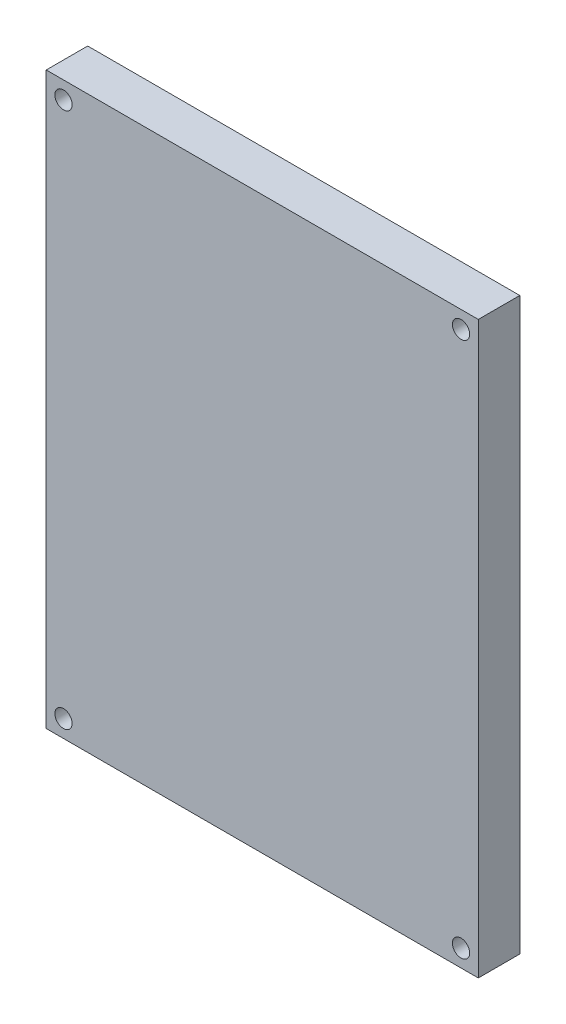
ISO-10303-21;
HEADER;
FILE_DESCRIPTION(('STEP AP214'),'2;1');
FILE_NAME('part.step','',(''),(''),'','','');
FILE_SCHEMA(('AUTOMOTIVE_DESIGN { 1 0 10303 214 1 1 1 1 }'));
ENDSEC;
DATA;
#1=APPLICATION_CONTEXT('core data for automotive mechanical design processes');
#2=APPLICATION_PROTOCOL_DEFINITION('international standard','automotive_design',2000,#1);
#3=PRODUCT_CONTEXT('',#1,'mechanical');
#4=PRODUCT('Part','Part','',(#3));
#5=PRODUCT_RELATED_PRODUCT_CATEGORY('part','',(#4));
#6=PRODUCT_DEFINITION_FORMATION('','',#4);
#7=PRODUCT_DEFINITION_CONTEXT('part definition',#1,'design');
#8=PRODUCT_DEFINITION('design','',#6,#7);
#9=PRODUCT_DEFINITION_SHAPE('','',#8);
#10=(LENGTH_UNIT() NAMED_UNIT(*) SI_UNIT(.MILLI.,.METRE.));
#11=(NAMED_UNIT(*) PLANE_ANGLE_UNIT() SI_UNIT($,.RADIAN.));
#12=(NAMED_UNIT(*) SI_UNIT($,.STERADIAN.) SOLID_ANGLE_UNIT());
#13=UNCERTAINTY_MEASURE_WITH_UNIT(LENGTH_MEASURE(1.E-05),#10,'distance_accuracy_value','');
#14=(GEOMETRIC_REPRESENTATION_CONTEXT(3) GLOBAL_UNCERTAINTY_ASSIGNED_CONTEXT((#13)) GLOBAL_UNIT_ASSIGNED_CONTEXT((#10,
#11,#12)) REPRESENTATION_CONTEXT('',''));
#15=CARTESIAN_POINT('',(0.,0.,0.));
#16=DIRECTION('',(0.,0.,1.));
#17=DIRECTION('',(1.,0.,0.));
#18=AXIS2_PLACEMENT_3D('',#15,#16,#17);
#19=CARTESIAN_POINT('',(0.,-45.5,4.));
#20=DIRECTION('',(0.,1.,0.));
#21=DIRECTION('',(0.,0.,1.));
#22=AXIS2_PLACEMENT_3D('',#19,#20,#21);
#23=PLANE('',#22);
#24=DIRECTION('',(0.,0.,-1.));
#25=VECTOR('',#24,1.);
#26=CARTESIAN_POINT('',(7.49999999999999,-45.5,4.));
#27=LINE('',#26,#25);
#28=CARTESIAN_POINT('',(7.49999999999999,-45.5,4.));
#29=VERTEX_POINT('',#28);
#30=CARTESIAN_POINT('',(7.49999999999999,-45.5,0.));
#31=VERTEX_POINT('',#30);
#32=EDGE_CURVE('E248',#29,#31,#27,.T.);
#33=ORIENTED_EDGE('',*,*,#32,.F.);
#34=DIRECTION('',(1.,0.,0.));
#35=VECTOR('',#34,1.);
#36=CARTESIAN_POINT('',(0.,-45.5,4.));
#37=LINE('',#36,#35);
#38=CARTESIAN_POINT('',(27.5,-45.5,4.));
#39=VERTEX_POINT('',#38);
#40=EDGE_CURVE('E234',#29,#39,#37,.T.);
#41=ORIENTED_EDGE('',*,*,#40,.T.);
#42=DIRECTION('',(0.,0.,1.));
#43=VECTOR('',#42,1.);
#44=CARTESIAN_POINT('',(27.5,-45.5,4.));
#45=LINE('',#44,#43);
#46=CARTESIAN_POINT('',(27.5,-45.5,0.));
#47=VERTEX_POINT('',#46);
#48=EDGE_CURVE('E380',#47,#39,#45,.T.);
#49=ORIENTED_EDGE('',*,*,#48,.F.);
#50=DIRECTION('',(1.,0.,0.));
#51=VECTOR('',#50,1.);
#52=CARTESIAN_POINT('',(0.,-45.5,0.));
#53=LINE('',#52,#51);
#54=EDGE_CURVE('E350',#31,#47,#53,.T.);
#55=ORIENTED_EDGE('',*,*,#54,.F.);
#56=EDGE_LOOP('',(#33,#41,#49,#55));
#57=FACE_BOUND('',#56,.T.);
#58=ADVANCED_FACE('F75',(#57),#23,.T.);
#59=CARTESIAN_POINT('',(32.5,35.,4.));
#60=DIRECTION('',(0.,-1.,0.));
#61=DIRECTION('',(0.,0.,-1.));
#62=AXIS2_PLACEMENT_3D('',#59,#60,#61);
#63=PLANE('',#62);
#64=DIRECTION('',(-1.,0.,0.));
#65=VECTOR('',#64,1.);
#66=CARTESIAN_POINT('',(32.5,35.,0.));
#67=LINE('',#66,#65);
#68=CARTESIAN_POINT('',(32.5,35.,0.));
#69=VERTEX_POINT('',#68);
#70=CARTESIAN_POINT('',(-30.,35.,0.));
#71=VERTEX_POINT('',#70);
#72=EDGE_CURVE('E342',#69,#71,#67,.T.);
#73=ORIENTED_EDGE('',*,*,#72,.T.);
#74=DIRECTION('',(0.,0.,-1.));
#75=VECTOR('',#74,1.);
#76=CARTESIAN_POINT('',(-30.,35.,4.));
#77=LINE('',#76,#75);
#78=CARTESIAN_POINT('',(-30.,35.,6.));
#79=VERTEX_POINT('',#78);
#80=EDGE_CURVE('E372',#79,#71,#77,.T.);
#81=ORIENTED_EDGE('',*,*,#80,.F.);
#82=DIRECTION('',(-1.,0.,0.));
#83=VECTOR('',#82,1.);
#84=CARTESIAN_POINT('',(-30.,35.,6.));
#85=LINE('',#84,#83);
#86=CARTESIAN_POINT('',(32.5,35.,6.));
#87=VERTEX_POINT('',#86);
#88=EDGE_CURVE('E277',#87,#79,#85,.T.);
#89=ORIENTED_EDGE('',*,*,#88,.F.);
#90=DIRECTION('',(0.,0.,-1.));
#91=VECTOR('',#90,1.);
#92=CARTESIAN_POINT('',(32.5,35.,4.));
#93=LINE('',#92,#91);
#94=EDGE_CURVE('E363',#87,#69,#93,.T.);
#95=ORIENTED_EDGE('',*,*,#94,.T.);
#96=EDGE_LOOP('',(#73,#81,#89,#95));
#97=FACE_BOUND('',#96,.T.);
#98=ADVANCED_FACE('F77',(#97),#63,.F.);
#99=CARTESIAN_POINT('',(-30.,35.,4.));
#100=DIRECTION('',(1.,0.,0.));
#101=DIRECTION('',(0.,0.,-1.));
#102=AXIS2_PLACEMENT_3D('',#99,#100,#101);
#103=PLANE('',#102);
#104=DIRECTION('',(0.,0.,-1.));
#105=VECTOR('',#104,1.);
#106=CARTESIAN_POINT('',(-30.,-47.5,4.));
#107=LINE('',#106,#105);
#108=CARTESIAN_POINT('',(-30.,-47.5,6.));
#109=VERTEX_POINT('',#108);
#110=CARTESIAN_POINT('',(-30.,-47.5,0.));
#111=VERTEX_POINT('',#110);
#112=EDGE_CURVE('E369',#109,#111,#107,.T.);
#113=ORIENTED_EDGE('',*,*,#112,.F.);
#114=DIRECTION('',(0.,-1.,0.));
#115=VECTOR('',#114,1.);
#116=CARTESIAN_POINT('',(-30.,-47.5,6.));
#117=LINE('',#116,#115);
#118=EDGE_CURVE('E268',#79,#109,#117,.T.);
#119=ORIENTED_EDGE('',*,*,#118,.F.);
#120=ORIENTED_EDGE('',*,*,#80,.T.);
#121=DIRECTION('',(0.,-1.,0.));
#122=VECTOR('',#121,1.);
#123=CARTESIAN_POINT('',(-30.,35.,0.));
#124=LINE('',#123,#122);
#125=EDGE_CURVE('E355',#71,#111,#124,.T.);
#126=ORIENTED_EDGE('',*,*,#125,.T.);
#127=EDGE_LOOP('',(#113,#119,#120,#126));
#128=FACE_BOUND('',#127,.T.);
#129=ADVANCED_FACE('F426',(#128),#103,.F.);
#130=CARTESIAN_POINT('',(-30.,-47.5,4.));
#131=DIRECTION('',(0.,1.,0.));
#132=DIRECTION('',(0.,0.,1.));
#133=AXIS2_PLACEMENT_3D('',#130,#131,#132);
#134=PLANE('',#133);
#135=DIRECTION('',(-1.,0.,0.));
#136=VECTOR('',#135,1.);
#137=CARTESIAN_POINT('',(7.49999999999999,-47.5,4.));
#138=LINE('',#137,#136);
#139=CARTESIAN_POINT('',(7.49999999999999,-47.5,4.));
#140=VERTEX_POINT('',#139);
#141=CARTESIAN_POINT('',(-5.,-47.5,4.));
#142=VERTEX_POINT('',#141);
#143=EDGE_CURVE('E231',#140,#142,#138,.T.);
#144=ORIENTED_EDGE('',*,*,#143,.F.);
#145=DIRECTION('',(0.,0.,-1.));
#146=VECTOR('',#145,1.);
#147=CARTESIAN_POINT('',(7.49999999999999,-47.5,4.));
#148=LINE('',#147,#146);
#149=CARTESIAN_POINT('',(7.49999999999999,-47.5,0.));
#150=VERTEX_POINT('',#149);
#151=EDGE_CURVE('E216',#140,#150,#148,.T.);
#152=ORIENTED_EDGE('',*,*,#151,.T.);
#153=DIRECTION('',(1.,0.,0.));
#154=VECTOR('',#153,1.);
#155=CARTESIAN_POINT('',(-30.,-47.5,0.));
#156=LINE('',#155,#154);
#157=CARTESIAN_POINT('',(32.5,-47.5,0.));
#158=VERTEX_POINT('',#157);
#159=EDGE_CURVE('E357',#150,#158,#156,.T.);
#160=ORIENTED_EDGE('',*,*,#159,.T.);
#161=DIRECTION('',(0.,0.,-1.));
#162=VECTOR('',#161,1.);
#163=CARTESIAN_POINT('',(32.5,-47.5,4.));
#164=LINE('',#163,#162);
#165=CARTESIAN_POINT('',(32.5,-47.5,6.));
#166=VERTEX_POINT('',#165);
#167=EDGE_CURVE('E366',#166,#158,#164,.T.);
#168=ORIENTED_EDGE('',*,*,#167,.F.);
#169=DIRECTION('',(1.,0.,0.));
#170=VECTOR('',#169,1.);
#171=CARTESIAN_POINT('',(-30.,-47.5,6.));
#172=LINE('',#171,#170);
#173=EDGE_CURVE('E271',#109,#166,#172,.T.);
#174=ORIENTED_EDGE('',*,*,#173,.F.);
#175=ORIENTED_EDGE('',*,*,#112,.T.);
#176=CARTESIAN_POINT('',(-5.,-47.5,0.));
#177=VERTEX_POINT('',#176);
#178=EDGE_CURVE('E358',#111,#177,#156,.T.);
#179=ORIENTED_EDGE('',*,*,#178,.T.);
#180=DIRECTION('',(0.,0.,-1.));
#181=VECTOR('',#180,1.);
#182=CARTESIAN_POINT('',(-5.,-47.5,4.));
#183=LINE('',#182,#181);
#184=EDGE_CURVE('E226',#142,#177,#183,.T.);
#185=ORIENTED_EDGE('',*,*,#184,.F.);
#186=EDGE_LOOP('',(#144,#152,#160,#168,#174,#175,#179,#185));
#187=FACE_BOUND('',#186,.T.);
#188=ADVANCED_FACE('F237',(#187),#134,.F.);
#189=CARTESIAN_POINT('',(32.5,-47.5,4.));
#190=DIRECTION('',(-1.,0.,0.));
#191=DIRECTION('',(0.,0.,1.));
#192=AXIS2_PLACEMENT_3D('',#189,#190,#191);
#193=PLANE('',#192);
#194=DIRECTION('',(0.,1.,0.));
#195=VECTOR('',#194,1.);
#196=CARTESIAN_POINT('',(32.5,-47.5,0.));
#197=LINE('',#196,#195);
#198=EDGE_CURVE('E361',#158,#69,#197,.T.);
#199=ORIENTED_EDGE('',*,*,#198,.T.);
#200=ORIENTED_EDGE('',*,*,#94,.F.);
#201=DIRECTION('',(0.,1.,0.));
#202=VECTOR('',#201,1.);
#203=CARTESIAN_POINT('',(32.5,-47.5,6.));
#204=LINE('',#203,#202);
#205=EDGE_CURVE('E274',#166,#87,#204,.T.);
#206=ORIENTED_EDGE('',*,*,#205,.F.);
#207=ORIENTED_EDGE('',*,*,#167,.T.);
#208=EDGE_LOOP('',(#199,#200,#206,#207));
#209=FACE_BOUND('',#208,.T.);
#210=ADVANCED_FACE('F431',(#209),#193,.F.);
#211=CARTESIAN_POINT('',(0.,0.,0.));
#212=DIRECTION('',(0.,0.,1.));
#213=DIRECTION('',(1.,0.,0.));
#214=AXIS2_PLACEMENT_3D('',#211,#212,#213);
#215=PLANE('',#214);
#216=CARTESIAN_POINT('',(30.,-45.,0.));
#217=DIRECTION('',(0.,0.,1.));
#218=DIRECTION('',(1.,0.,0.));
#219=AXIS2_PLACEMENT_3D('',#216,#217,#218);
#220=CIRCLE('',#219,1.25);
#221=CARTESIAN_POINT('',(31.25,-45.,0.));
#222=VERTEX_POINT('',#221);
#223=EDGE_CURVE('E79',#222,#222,#220,.T.);
#224=ORIENTED_EDGE('',*,*,#223,.T.);
#225=EDGE_LOOP('',(#224));
#226=FACE_BOUND('',#225,.T.);
#227=CARTESIAN_POINT('',(-27.5,32.5,0.));
#228=DIRECTION('',(0.,0.,1.));
#229=DIRECTION('',(1.,0.,0.));
#230=AXIS2_PLACEMENT_3D('',#227,#228,#229);
#231=CIRCLE('',#230,1.25);
#232=CARTESIAN_POINT('',(-26.25,32.5,0.));
#233=VERTEX_POINT('',#232);
#234=EDGE_CURVE('E395',#233,#233,#231,.T.);
#235=ORIENTED_EDGE('',*,*,#234,.T.);
#236=EDGE_LOOP('',(#235));
#237=FACE_BOUND('',#236,.T.);
#238=CARTESIAN_POINT('',(30.,32.5,0.));
#239=DIRECTION('',(0.,0.,1.));
#240=DIRECTION('',(1.,0.,0.));
#241=AXIS2_PLACEMENT_3D('',#238,#239,#240);
#242=CIRCLE('',#241,1.25);
#243=CARTESIAN_POINT('',(31.25,32.5,0.));
#244=VERTEX_POINT('',#243);
#245=EDGE_CURVE('E393',#244,#244,#242,.T.);
#246=ORIENTED_EDGE('',*,*,#245,.T.);
#247=EDGE_LOOP('',(#246));
#248=FACE_BOUND('',#247,.T.);
#249=CARTESIAN_POINT('',(-27.5,-45.,0.));
#250=DIRECTION('',(0.,0.,1.));
#251=DIRECTION('',(1.,0.,0.));
#252=AXIS2_PLACEMENT_3D('',#249,#250,#251);
#253=CIRCLE('',#252,1.25);
#254=CARTESIAN_POINT('',(-26.25,-45.,0.));
#255=VERTEX_POINT('',#254);
#256=EDGE_CURVE('E267',#255,#255,#253,.T.);
#257=ORIENTED_EDGE('',*,*,#256,.T.);
#258=EDGE_LOOP('',(#257));
#259=FACE_BOUND('',#258,.T.);
#260=ORIENTED_EDGE('',*,*,#159,.F.);
#261=DIRECTION('',(0.,-1.,0.));
#262=VECTOR('',#261,1.);
#263=CARTESIAN_POINT('',(7.49999999999999,-47.5,0.));
#264=LINE('',#263,#262);
#265=EDGE_CURVE('E222',#31,#150,#264,.T.);
#266=ORIENTED_EDGE('',*,*,#265,.F.);
#267=ORIENTED_EDGE('',*,*,#54,.T.);
#268=DIRECTION('',(0.,1.,0.));
#269=VECTOR('',#268,1.);
#270=CARTESIAN_POINT('',(27.5,-47.5,0.));
#271=LINE('',#270,#269);
#272=CARTESIAN_POINT('',(27.5,-42.5,0.));
#273=VERTEX_POINT('',#272);
#274=EDGE_CURVE('E308',#47,#273,#271,.T.);
#275=ORIENTED_EDGE('',*,*,#274,.T.);
#276=DIRECTION('',(1.,0.,0.));
#277=VECTOR('',#276,1.);
#278=CARTESIAN_POINT('',(32.5,-42.5,0.));
#279=LINE('',#278,#277);
#280=CARTESIAN_POINT('',(30.5,-42.5,0.));
#281=VERTEX_POINT('',#280);
#282=EDGE_CURVE('E304',#273,#281,#279,.T.);
#283=ORIENTED_EDGE('',*,*,#282,.T.);
#284=DIRECTION('',(0.,1.,0.));
#285=VECTOR('',#284,1.);
#286=CARTESIAN_POINT('',(30.5,0.,0.));
#287=LINE('',#286,#285);
#288=CARTESIAN_POINT('',(30.5,30.,0.));
#289=VERTEX_POINT('',#288);
#290=EDGE_CURVE('E321',#281,#289,#287,.T.);
#291=ORIENTED_EDGE('',*,*,#290,.T.);
#292=DIRECTION('',(-1.,0.,0.));
#293=VECTOR('',#292,1.);
#294=CARTESIAN_POINT('',(32.5,30.,0.));
#295=LINE('',#294,#293);
#296=CARTESIAN_POINT('',(27.5,30.,0.));
#297=VERTEX_POINT('',#296);
#298=EDGE_CURVE('E294',#289,#297,#295,.T.);
#299=ORIENTED_EDGE('',*,*,#298,.T.);
#300=DIRECTION('',(0.,1.,0.));
#301=VECTOR('',#300,1.);
#302=CARTESIAN_POINT('',(27.5,35.,0.));
#303=LINE('',#302,#301);
#304=CARTESIAN_POINT('',(27.5,33.,0.));
#305=VERTEX_POINT('',#304);
#306=EDGE_CURVE('E292',#297,#305,#303,.T.);
#307=ORIENTED_EDGE('',*,*,#306,.T.);
#308=DIRECTION('',(-1.,0.,0.));
#309=VECTOR('',#308,1.);
#310=CARTESIAN_POINT('',(0.,33.,0.));
#311=LINE('',#310,#309);
#312=CARTESIAN_POINT('',(-25.,33.,0.));
#313=VERTEX_POINT('',#312);
#314=EDGE_CURVE('E345',#305,#313,#311,.T.);
#315=ORIENTED_EDGE('',*,*,#314,.T.);
#316=DIRECTION('',(0.,-1.,0.));
#317=VECTOR('',#316,1.);
#318=CARTESIAN_POINT('',(-25.,35.,0.));
#319=LINE('',#318,#317);
#320=CARTESIAN_POINT('',(-25.,30.,0.));
#321=VERTEX_POINT('',#320);
#322=EDGE_CURVE('E283',#313,#321,#319,.T.);
#323=ORIENTED_EDGE('',*,*,#322,.T.);
#324=DIRECTION('',(-1.,0.,0.));
#325=VECTOR('',#324,1.);
#326=CARTESIAN_POINT('',(-30.,30.,0.));
#327=LINE('',#326,#325);
#328=CARTESIAN_POINT('',(-28.,30.,0.));
#329=VERTEX_POINT('',#328);
#330=EDGE_CURVE('E100',#321,#329,#327,.T.);
#331=ORIENTED_EDGE('',*,*,#330,.T.);
#332=DIRECTION('',(0.,-1.,0.));
#333=VECTOR('',#332,1.);
#334=CARTESIAN_POINT('',(-28.,0.,0.));
#335=LINE('',#334,#333);
#336=CARTESIAN_POINT('',(-28.,-42.5,0.));
#337=VERTEX_POINT('',#336);
#338=EDGE_CURVE('E348',#329,#337,#335,.T.);
#339=ORIENTED_EDGE('',*,*,#338,.T.);
#340=DIRECTION('',(1.,0.,0.));
#341=VECTOR('',#340,1.);
#342=CARTESIAN_POINT('',(-30.,-42.5,0.));
#343=LINE('',#342,#341);
#344=CARTESIAN_POINT('',(-25.,-42.5,0.));
#345=VERTEX_POINT('',#344);
#346=EDGE_CURVE('E318',#337,#345,#343,.T.);
#347=ORIENTED_EDGE('',*,*,#346,.T.);
#348=DIRECTION('',(0.,-1.,0.));
#349=VECTOR('',#348,1.);
#350=CARTESIAN_POINT('',(-25.,-47.5,0.));
#351=LINE('',#350,#349);
#352=CARTESIAN_POINT('',(-25.,-45.5,0.));
#353=VERTEX_POINT('',#352);
#354=EDGE_CURVE('E316',#345,#353,#351,.T.);
#355=ORIENTED_EDGE('',*,*,#354,.T.);
#356=CARTESIAN_POINT('',(-5.,-45.5,0.));
#357=VERTEX_POINT('',#356);
#358=EDGE_CURVE('E332',#353,#357,#53,.T.);
#359=ORIENTED_EDGE('',*,*,#358,.T.);
#360=DIRECTION('',(0.,1.,0.));
#361=VECTOR('',#360,1.);
#362=CARTESIAN_POINT('',(-5.,-47.5,0.));
#363=LINE('',#362,#361);
#364=EDGE_CURVE('E235',#177,#357,#363,.T.);
#365=ORIENTED_EDGE('',*,*,#364,.F.);
#366=ORIENTED_EDGE('',*,*,#178,.F.);
#367=ORIENTED_EDGE('',*,*,#125,.F.);
#368=ORIENTED_EDGE('',*,*,#72,.F.);
#369=ORIENTED_EDGE('',*,*,#198,.F.);
#370=EDGE_LOOP('',(#260,#266,#267,#275,#283,#291,#299,#307,#315,#323,#331,#339,#347,#355,#359,
#365,#366,#367,#368,#369));
#371=FACE_BOUND('',#370,.T.);
#372=ADVANCED_FACE('F402',(#226,#237,#248,#259,#371),#215,.F.);
#373=CARTESIAN_POINT('',(30.5,0.,4.));
#374=DIRECTION('',(-1.,0.,0.));
#375=DIRECTION('',(0.,0.,1.));
#376=AXIS2_PLACEMENT_3D('',#373,#374,#375);
#377=PLANE('',#376);
#378=DIRECTION('',(0.,0.,1.));
#379=VECTOR('',#378,1.);
#380=CARTESIAN_POINT('',(30.5,30.,4.));
#381=LINE('',#380,#379);
#382=CARTESIAN_POINT('',(30.5,30.,4.));
#383=VERTEX_POINT('',#382);
#384=EDGE_CURVE('E388',#289,#383,#381,.T.);
#385=ORIENTED_EDGE('',*,*,#384,.F.);
#386=ORIENTED_EDGE('',*,*,#290,.F.);
#387=DIRECTION('',(0.,0.,-1.));
#388=VECTOR('',#387,1.);
#389=CARTESIAN_POINT('',(30.5,-42.5,4.));
#390=LINE('',#389,#388);
#391=CARTESIAN_POINT('',(30.5,-42.5,4.));
#392=VERTEX_POINT('',#391);
#393=EDGE_CURVE('E383',#392,#281,#390,.T.);
#394=ORIENTED_EDGE('',*,*,#393,.F.);
#395=DIRECTION('',(0.,1.,0.));
#396=VECTOR('',#395,1.);
#397=CARTESIAN_POINT('',(30.5,0.,4.));
#398=LINE('',#397,#396);
#399=EDGE_CURVE('E328',#392,#383,#398,.T.);
#400=ORIENTED_EDGE('',*,*,#399,.T.);
#401=EDGE_LOOP('',(#385,#386,#394,#400));
#402=FACE_BOUND('',#401,.T.);
#403=ADVANCED_FACE('F495',(#402),#377,.T.);
#404=CARTESIAN_POINT('',(0.,33.,4.));
#405=DIRECTION('',(0.,-1.,0.));
#406=DIRECTION('',(0.,0.,-1.));
#407=AXIS2_PLACEMENT_3D('',#404,#405,#406);
#408=PLANE('',#407);
#409=DIRECTION('',(0.,0.,1.));
#410=VECTOR('',#409,1.);
#411=CARTESIAN_POINT('',(-25.,33.,4.));
#412=LINE('',#411,#410);
#413=CARTESIAN_POINT('',(-25.,33.,4.));
#414=VERTEX_POINT('',#413);
#415=EDGE_CURVE('E12',#313,#414,#412,.T.);
#416=ORIENTED_EDGE('',*,*,#415,.F.);
#417=ORIENTED_EDGE('',*,*,#314,.F.);
#418=DIRECTION('',(0.,0.,-1.));
#419=VECTOR('',#418,1.);
#420=CARTESIAN_POINT('',(27.5,33.,4.));
#421=LINE('',#420,#419);
#422=CARTESIAN_POINT('',(27.5,33.,4.));
#423=VERTEX_POINT('',#422);
#424=EDGE_CURVE('E385',#423,#305,#421,.T.);
#425=ORIENTED_EDGE('',*,*,#424,.F.);
#426=DIRECTION('',(-1.,0.,0.));
#427=VECTOR('',#426,1.);
#428=CARTESIAN_POINT('',(0.,33.,4.));
#429=LINE('',#428,#427);
#430=EDGE_CURVE('E331',#423,#414,#429,.T.);
#431=ORIENTED_EDGE('',*,*,#430,.T.);
#432=EDGE_LOOP('',(#416,#417,#425,#431));
#433=FACE_BOUND('',#432,.T.);
#434=ADVANCED_FACE('F458',(#433),#408,.T.);
#435=CARTESIAN_POINT('',(-28.,0.,4.));
#436=DIRECTION('',(1.,0.,0.));
#437=DIRECTION('',(0.,0.,-1.));
#438=AXIS2_PLACEMENT_3D('',#435,#436,#437);
#439=PLANE('',#438);
#440=DIRECTION('',(0.,0.,-1.));
#441=VECTOR('',#440,1.);
#442=CARTESIAN_POINT('',(-28.,30.,4.));
#443=LINE('',#442,#441);
#444=CARTESIAN_POINT('',(-28.,30.,4.));
#445=VERTEX_POINT('',#444);
#446=EDGE_CURVE('E84',#445,#329,#443,.T.);
#447=ORIENTED_EDGE('',*,*,#446,.F.);
#448=DIRECTION('',(0.,-1.,0.));
#449=VECTOR('',#448,1.);
#450=CARTESIAN_POINT('',(-28.,0.,4.));
#451=LINE('',#450,#449);
#452=CARTESIAN_POINT('',(-28.,-42.5,4.));
#453=VERTEX_POINT('',#452);
#454=EDGE_CURVE('E335',#445,#453,#451,.T.);
#455=ORIENTED_EDGE('',*,*,#454,.T.);
#456=DIRECTION('',(0.,0.,1.));
#457=VECTOR('',#456,1.);
#458=CARTESIAN_POINT('',(-28.,-42.5,4.));
#459=LINE('',#458,#457);
#460=EDGE_CURVE('E378',#337,#453,#459,.T.);
#461=ORIENTED_EDGE('',*,*,#460,.F.);
#462=ORIENTED_EDGE('',*,*,#338,.F.);
#463=EDGE_LOOP('',(#447,#455,#461,#462));
#464=FACE_BOUND('',#463,.T.);
#465=ADVANCED_FACE('F450',(#464),#439,.T.);
#466=DIRECTION('',(0.,0.,-1.));
#467=VECTOR('',#466,1.);
#468=CARTESIAN_POINT('',(-5.,-45.5,4.));
#469=LINE('',#468,#467);
#470=CARTESIAN_POINT('',(-5.,-45.5,4.));
#471=VERTEX_POINT('',#470);
#472=EDGE_CURVE('E251',#471,#357,#469,.T.);
#473=ORIENTED_EDGE('',*,*,#472,.T.);
#474=ORIENTED_EDGE('',*,*,#358,.F.);
#475=DIRECTION('',(0.,0.,-1.));
#476=VECTOR('',#475,1.);
#477=CARTESIAN_POINT('',(-25.,-45.5,4.));
#478=LINE('',#477,#476);
#479=CARTESIAN_POINT('',(-25.,-45.5,4.));
#480=VERTEX_POINT('',#479);
#481=EDGE_CURVE('E375',#480,#353,#478,.T.);
#482=ORIENTED_EDGE('',*,*,#481,.F.);
#483=EDGE_CURVE('E338',#480,#471,#37,.T.);
#484=ORIENTED_EDGE('',*,*,#483,.T.);
#485=EDGE_LOOP('',(#473,#474,#482,#484));
#486=FACE_BOUND('',#485,.T.);
#487=ADVANCED_FACE('F441',(#486),#23,.T.);
#488=CARTESIAN_POINT('',(-25.,-47.5,-7.07106781186548));
#489=DIRECTION('',(1.,0.,0.));
#490=DIRECTION('',(0.,0.,-1.));
#491=AXIS2_PLACEMENT_3D('',#488,#489,#490);
#492=PLANE('',#491);
#493=DIRECTION('',(0.,1.,0.));
#494=VECTOR('',#493,1.);
#495=CARTESIAN_POINT('',(-25.,-47.5,4.));
#496=LINE('',#495,#494);
#497=CARTESIAN_POINT('',(-25.,-42.5,4.));
#498=VERTEX_POINT('',#497);
#499=EDGE_CURVE('E307',#480,#498,#496,.T.);
#500=ORIENTED_EDGE('',*,*,#499,.F.);
#501=ORIENTED_EDGE('',*,*,#481,.T.);
#502=ORIENTED_EDGE('',*,*,#354,.F.);
#503=DIRECTION('',(0.,0.,1.));
#504=VECTOR('',#503,1.);
#505=CARTESIAN_POINT('',(-25.,-42.5,-7.07106781186548));
#506=LINE('',#505,#504);
#507=EDGE_CURVE('E319',#345,#498,#506,.T.);
#508=ORIENTED_EDGE('',*,*,#507,.T.);
#509=EDGE_LOOP('',(#500,#501,#502,#508));
#510=FACE_BOUND('',#509,.T.);
#511=ADVANCED_FACE('F449',(#510),#492,.T.);
#512=CARTESIAN_POINT('',(-30.,-42.5,-7.07106781186548));
#513=DIRECTION('',(0.,1.,0.));
#514=DIRECTION('',(0.,0.,1.));
#515=AXIS2_PLACEMENT_3D('',#512,#513,#514);
#516=PLANE('',#515);
#517=ORIENTED_EDGE('',*,*,#346,.F.);
#518=ORIENTED_EDGE('',*,*,#460,.T.);
#519=DIRECTION('',(-1.,0.,0.));
#520=VECTOR('',#519,1.);
#521=CARTESIAN_POINT('',(-30.,-42.5,4.));
#522=LINE('',#521,#520);
#523=EDGE_CURVE('E324',#498,#453,#522,.T.);
#524=ORIENTED_EDGE('',*,*,#523,.F.);
#525=ORIENTED_EDGE('',*,*,#507,.F.);
#526=EDGE_LOOP('',(#517,#518,#524,#525));
#527=FACE_BOUND('',#526,.T.);
#528=ADVANCED_FACE('F455',(#527),#516,.T.);
#529=CARTESIAN_POINT('',(32.5,-42.5,-7.07106781186548));
#530=DIRECTION('',(0.,1.,0.));
#531=DIRECTION('',(0.,0.,1.));
#532=AXIS2_PLACEMENT_3D('',#529,#530,#531);
#533=PLANE('',#532);
#534=DIRECTION('',(-1.,0.,0.));
#535=VECTOR('',#534,1.);
#536=CARTESIAN_POINT('',(32.5,-42.5,4.));
#537=LINE('',#536,#535);
#538=CARTESIAN_POINT('',(27.5,-42.5,4.));
#539=VERTEX_POINT('',#538);
#540=EDGE_CURVE('E297',#392,#539,#537,.T.);
#541=ORIENTED_EDGE('',*,*,#540,.F.);
#542=ORIENTED_EDGE('',*,*,#393,.T.);
#543=ORIENTED_EDGE('',*,*,#282,.F.);
#544=DIRECTION('',(0.,0.,1.));
#545=VECTOR('',#544,1.);
#546=CARTESIAN_POINT('',(27.5,-42.5,-7.07106781186548));
#547=LINE('',#546,#545);
#548=EDGE_CURVE('E310',#273,#539,#547,.T.);
#549=ORIENTED_EDGE('',*,*,#548,.T.);
#550=EDGE_LOOP('',(#541,#542,#543,#549));
#551=FACE_BOUND('',#550,.T.);
#552=ADVANCED_FACE('F498',(#551),#533,.T.);
#553=CARTESIAN_POINT('',(27.5,-47.5,-7.07106781186548));
#554=DIRECTION('',(-1.,0.,0.));
#555=DIRECTION('',(0.,0.,1.));
#556=AXIS2_PLACEMENT_3D('',#553,#554,#555);
#557=PLANE('',#556);
#558=ORIENTED_EDGE('',*,*,#274,.F.);
#559=ORIENTED_EDGE('',*,*,#48,.T.);
#560=DIRECTION('',(0.,-1.,0.));
#561=VECTOR('',#560,1.);
#562=CARTESIAN_POINT('',(27.5,-47.5,4.));
#563=LINE('',#562,#561);
#564=EDGE_CURVE('E313',#539,#39,#563,.T.);
#565=ORIENTED_EDGE('',*,*,#564,.F.);
#566=ORIENTED_EDGE('',*,*,#548,.F.);
#567=EDGE_LOOP('',(#558,#559,#565,#566));
#568=FACE_BOUND('',#567,.T.);
#569=ADVANCED_FACE('F505',(#568),#557,.T.);
#570=CARTESIAN_POINT('',(27.5,35.,-7.07106781186548));
#571=DIRECTION('',(-1.,0.,0.));
#572=DIRECTION('',(0.,0.,1.));
#573=AXIS2_PLACEMENT_3D('',#570,#571,#572);
#574=PLANE('',#573);
#575=DIRECTION('',(0.,-1.,0.));
#576=VECTOR('',#575,1.);
#577=CARTESIAN_POINT('',(27.5,35.,4.));
#578=LINE('',#577,#576);
#579=CARTESIAN_POINT('',(27.5,30.,4.));
#580=VERTEX_POINT('',#579);
#581=EDGE_CURVE('E282',#423,#580,#578,.T.);
#582=ORIENTED_EDGE('',*,*,#581,.F.);
#583=ORIENTED_EDGE('',*,*,#424,.T.);
#584=ORIENTED_EDGE('',*,*,#306,.F.);
#585=DIRECTION('',(0.,0.,1.));
#586=VECTOR('',#585,1.);
#587=CARTESIAN_POINT('',(27.5,30.,-7.07106781186548));
#588=LINE('',#587,#586);
#589=EDGE_CURVE('E295',#297,#580,#588,.T.);
#590=ORIENTED_EDGE('',*,*,#589,.T.);
#591=EDGE_LOOP('',(#582,#583,#584,#590));
#592=FACE_BOUND('',#591,.T.);
#593=ADVANCED_FACE('F485',(#592),#574,.T.);
#594=CARTESIAN_POINT('',(32.5,30.,-7.07106781186548));
#595=DIRECTION('',(0.,-1.,0.));
#596=DIRECTION('',(0.,0.,-1.));
#597=AXIS2_PLACEMENT_3D('',#594,#595,#596);
#598=PLANE('',#597);
#599=ORIENTED_EDGE('',*,*,#298,.F.);
#600=ORIENTED_EDGE('',*,*,#384,.T.);
#601=DIRECTION('',(1.,0.,0.));
#602=VECTOR('',#601,1.);
#603=CARTESIAN_POINT('',(32.5,30.,4.));
#604=LINE('',#603,#602);
#605=EDGE_CURVE('E300',#580,#383,#604,.T.);
#606=ORIENTED_EDGE('',*,*,#605,.F.);
#607=ORIENTED_EDGE('',*,*,#589,.F.);
#608=EDGE_LOOP('',(#599,#600,#606,#607));
#609=FACE_BOUND('',#608,.T.);
#610=ADVANCED_FACE('F490',(#609),#598,.T.);
#611=CARTESIAN_POINT('',(-30.,30.,-7.07106781186548));
#612=DIRECTION('',(0.,-1.,0.));
#613=DIRECTION('',(0.,0.,-1.));
#614=AXIS2_PLACEMENT_3D('',#611,#612,#613);
#615=PLANE('',#614);
#616=DIRECTION('',(1.,0.,0.));
#617=VECTOR('',#616,1.);
#618=CARTESIAN_POINT('',(-30.,30.,4.));
#619=LINE('',#618,#617);
#620=CARTESIAN_POINT('',(-25.,30.,4.));
#621=VERTEX_POINT('',#620);
#622=EDGE_CURVE('E280',#445,#621,#619,.T.);
#623=ORIENTED_EDGE('',*,*,#622,.F.);
#624=ORIENTED_EDGE('',*,*,#446,.T.);
#625=ORIENTED_EDGE('',*,*,#330,.F.);
#626=DIRECTION('',(0.,0.,1.));
#627=VECTOR('',#626,1.);
#628=CARTESIAN_POINT('',(-25.,30.,-7.07106781186548));
#629=LINE('',#628,#627);
#630=EDGE_CURVE('E285',#321,#621,#629,.T.);
#631=ORIENTED_EDGE('',*,*,#630,.T.);
#632=EDGE_LOOP('',(#623,#624,#625,#631));
#633=FACE_BOUND('',#632,.T.);
#634=ADVANCED_FACE('F473',(#633),#615,.T.);
#635=CARTESIAN_POINT('',(-25.,35.,-7.07106781186548));
#636=DIRECTION('',(1.,0.,0.));
#637=DIRECTION('',(0.,0.,-1.));
#638=AXIS2_PLACEMENT_3D('',#635,#636,#637);
#639=PLANE('',#638);
#640=ORIENTED_EDGE('',*,*,#322,.F.);
#641=ORIENTED_EDGE('',*,*,#415,.T.);
#642=DIRECTION('',(0.,1.,0.));
#643=VECTOR('',#642,1.);
#644=CARTESIAN_POINT('',(-25.,35.,4.));
#645=LINE('',#644,#643);
#646=EDGE_CURVE('E288',#621,#414,#645,.T.);
#647=ORIENTED_EDGE('',*,*,#646,.F.);
#648=ORIENTED_EDGE('',*,*,#630,.F.);
#649=EDGE_LOOP('',(#640,#641,#647,#648));
#650=FACE_BOUND('',#649,.T.);
#651=ADVANCED_FACE('F478',(#650),#639,.T.);
#652=CARTESIAN_POINT('',(0.,0.,4.));
#653=DIRECTION('',(0.,0.,-1.));
#654=DIRECTION('',(-1.,0.,0.));
#655=AXIS2_PLACEMENT_3D('',#652,#653,#654);
#656=PLANE('',#655);
#657=ORIENTED_EDGE('',*,*,#454,.F.);
#658=ORIENTED_EDGE('',*,*,#622,.T.);
#659=ORIENTED_EDGE('',*,*,#646,.T.);
#660=ORIENTED_EDGE('',*,*,#430,.F.);
#661=ORIENTED_EDGE('',*,*,#581,.T.);
#662=ORIENTED_EDGE('',*,*,#605,.T.);
#663=ORIENTED_EDGE('',*,*,#399,.F.);
#664=ORIENTED_EDGE('',*,*,#540,.T.);
#665=ORIENTED_EDGE('',*,*,#564,.T.);
#666=ORIENTED_EDGE('',*,*,#40,.F.);
#667=DIRECTION('',(0.,-1.,0.));
#668=VECTOR('',#667,1.);
#669=CARTESIAN_POINT('',(7.49999999999999,-47.5,4.));
#670=LINE('',#669,#668);
#671=EDGE_CURVE('E219',#29,#140,#670,.T.);
#672=ORIENTED_EDGE('',*,*,#671,.T.);
#673=ORIENTED_EDGE('',*,*,#143,.T.);
#674=DIRECTION('',(0.,1.,0.));
#675=VECTOR('',#674,1.);
#676=CARTESIAN_POINT('',(-5.,-47.5,4.));
#677=LINE('',#676,#675);
#678=EDGE_CURVE('E92',#142,#471,#677,.T.);
#679=ORIENTED_EDGE('',*,*,#678,.T.);
#680=ORIENTED_EDGE('',*,*,#483,.F.);
#681=ORIENTED_EDGE('',*,*,#499,.T.);
#682=ORIENTED_EDGE('',*,*,#523,.T.);
#683=EDGE_LOOP('',(#657,#658,#659,#660,#661,#662,#663,#664,#665,#666,#672,#673,#679,#680,#681,#682));
#684=FACE_BOUND('',#683,.T.);
#685=ADVANCED_FACE('F230',(#684),#656,.T.);
#686=CARTESIAN_POINT('',(0.,0.,6.));
#687=DIRECTION('',(0.,0.,-1.));
#688=DIRECTION('',(-1.,0.,0.));
#689=AXIS2_PLACEMENT_3D('',#686,#687,#688);
#690=PLANE('',#689);
#691=CARTESIAN_POINT('',(30.,32.5,6.));
#692=DIRECTION('',(0.,0.,-1.));
#693=DIRECTION('',(-1.,0.,0.));
#694=AXIS2_PLACEMENT_3D('',#691,#692,#693);
#695=CIRCLE('',#694,1.25);
#696=CARTESIAN_POINT('',(28.75,32.5,6.));
#697=VERTEX_POINT('',#696);
#698=EDGE_CURVE('E250',#697,#697,#695,.T.);
#699=ORIENTED_EDGE('',*,*,#698,.T.);
#700=EDGE_LOOP('',(#699));
#701=FACE_BOUND('',#700,.T.);
#702=CARTESIAN_POINT('',(30.,-45.,6.));
#703=DIRECTION('',(0.,0.,-1.));
#704=DIRECTION('',(-1.,0.,0.));
#705=AXIS2_PLACEMENT_3D('',#702,#703,#704);
#706=CIRCLE('',#705,1.25);
#707=CARTESIAN_POINT('',(28.75,-45.,6.));
#708=VERTEX_POINT('',#707);
#709=EDGE_CURVE('E260',#708,#708,#706,.T.);
#710=ORIENTED_EDGE('',*,*,#709,.T.);
#711=EDGE_LOOP('',(#710));
#712=FACE_BOUND('',#711,.T.);
#713=CARTESIAN_POINT('',(-27.5,-45.,6.));
#714=DIRECTION('',(0.,0.,-1.));
#715=DIRECTION('',(-1.,0.,0.));
#716=AXIS2_PLACEMENT_3D('',#713,#714,#715);
#717=CIRCLE('',#716,1.25);
#718=CARTESIAN_POINT('',(-28.75,-45.,6.));
#719=VERTEX_POINT('',#718);
#720=EDGE_CURVE('E256',#719,#719,#717,.T.);
#721=ORIENTED_EDGE('',*,*,#720,.T.);
#722=EDGE_LOOP('',(#721));
#723=FACE_BOUND('',#722,.T.);
#724=CARTESIAN_POINT('',(-27.5,32.5,6.));
#725=DIRECTION('',(0.,0.,-1.));
#726=DIRECTION('',(-1.,0.,0.));
#727=AXIS2_PLACEMENT_3D('',#724,#725,#726);
#728=CIRCLE('',#727,1.25);
#729=CARTESIAN_POINT('',(-28.75,32.5,6.));
#730=VERTEX_POINT('',#729);
#731=EDGE_CURVE('E259',#730,#730,#728,.T.);
#732=ORIENTED_EDGE('',*,*,#731,.T.);
#733=EDGE_LOOP('',(#732));
#734=FACE_BOUND('',#733,.T.);
#735=ORIENTED_EDGE('',*,*,#118,.T.);
#736=ORIENTED_EDGE('',*,*,#173,.T.);
#737=ORIENTED_EDGE('',*,*,#205,.T.);
#738=ORIENTED_EDGE('',*,*,#88,.T.);
#739=EDGE_LOOP('',(#735,#736,#737,#738));
#740=FACE_BOUND('',#739,.T.);
#741=ADVANCED_FACE('F411',(#701,#712,#723,#734,#740),#690,.F.);
#742=CARTESIAN_POINT('',(-27.5,-45.,-1.));
#743=DIRECTION('',(0.,0.,1.));
#744=DIRECTION('',(1.,0.,0.));
#745=AXIS2_PLACEMENT_3D('',#742,#743,#744);
#746=CYLINDRICAL_SURFACE('',#745,1.25);
#747=ORIENTED_EDGE('',*,*,#256,.F.);
#748=EDGE_LOOP('',(#747));
#749=FACE_BOUND('',#748,.T.);
#750=ORIENTED_EDGE('',*,*,#720,.F.);
#751=EDGE_LOOP('',(#750));
#752=FACE_BOUND('',#751,.T.);
#753=ADVANCED_FACE('F414',(#749,#752),#746,.F.);
#754=CARTESIAN_POINT('',(30.,32.5,-1.));
#755=DIRECTION('',(0.,0.,1.));
#756=DIRECTION('',(1.,0.,0.));
#757=AXIS2_PLACEMENT_3D('',#754,#755,#756);
#758=CYLINDRICAL_SURFACE('',#757,1.25);
#759=ORIENTED_EDGE('',*,*,#245,.F.);
#760=EDGE_LOOP('',(#759));
#761=FACE_BOUND('',#760,.T.);
#762=ORIENTED_EDGE('',*,*,#698,.F.);
#763=EDGE_LOOP('',(#762));
#764=FACE_BOUND('',#763,.T.);
#765=ADVANCED_FACE('F578',(#761,#764),#758,.F.);
#766=CARTESIAN_POINT('',(-27.5,32.5,-1.));
#767=DIRECTION('',(0.,0.,1.));
#768=DIRECTION('',(1.,0.,0.));
#769=AXIS2_PLACEMENT_3D('',#766,#767,#768);
#770=CYLINDRICAL_SURFACE('',#769,1.25);
#771=ORIENTED_EDGE('',*,*,#234,.F.);
#772=EDGE_LOOP('',(#771));
#773=FACE_BOUND('',#772,.T.);
#774=ORIENTED_EDGE('',*,*,#731,.F.);
#775=EDGE_LOOP('',(#774));
#776=FACE_BOUND('',#775,.T.);
#777=ADVANCED_FACE('F407',(#773,#776),#770,.F.);
#778=CARTESIAN_POINT('',(30.,-45.,-1.));
#779=DIRECTION('',(0.,0.,1.));
#780=DIRECTION('',(1.,0.,0.));
#781=AXIS2_PLACEMENT_3D('',#778,#779,#780);
#782=CYLINDRICAL_SURFACE('',#781,1.25);
#783=ORIENTED_EDGE('',*,*,#223,.F.);
#784=EDGE_LOOP('',(#783));
#785=FACE_BOUND('',#784,.T.);
#786=ORIENTED_EDGE('',*,*,#709,.F.);
#787=EDGE_LOOP('',(#786));
#788=FACE_BOUND('',#787,.T.);
#789=ADVANCED_FACE('F404',(#785,#788),#782,.F.);
#790=CARTESIAN_POINT('',(7.49999999999999,-47.5,4.));
#791=DIRECTION('',(1.,0.,0.));
#792=DIRECTION('',(0.,0.,-1.));
#793=AXIS2_PLACEMENT_3D('',#790,#791,#792);
#794=PLANE('',#793);
#795=ORIENTED_EDGE('',*,*,#265,.T.);
#796=ORIENTED_EDGE('',*,*,#151,.F.);
#797=ORIENTED_EDGE('',*,*,#671,.F.);
#798=ORIENTED_EDGE('',*,*,#32,.T.);
#799=EDGE_LOOP('',(#795,#796,#797,#798));
#800=FACE_BOUND('',#799,.T.);
#801=ADVANCED_FACE('F218',(#800),#794,.F.);
#802=CARTESIAN_POINT('',(-5.,-47.5,4.));
#803=DIRECTION('',(-1.,0.,0.));
#804=DIRECTION('',(0.,0.,1.));
#805=AXIS2_PLACEMENT_3D('',#802,#803,#804);
#806=PLANE('',#805);
#807=ORIENTED_EDGE('',*,*,#364,.T.);
#808=ORIENTED_EDGE('',*,*,#472,.F.);
#809=ORIENTED_EDGE('',*,*,#678,.F.);
#810=ORIENTED_EDGE('',*,*,#184,.T.);
#811=EDGE_LOOP('',(#807,#808,#809,#810));
#812=FACE_BOUND('',#811,.T.);
#813=ADVANCED_FACE('F624',(#812),#806,.F.);
#814=CLOSED_SHELL('',(#58,#98,#129,#188,#210,#372,#403,#434,#465,#487,#511,#528,#552,#569,#593,
#610,#634,#651,#685,#741,#753,#765,#777,#789,#801,#813));
#815=MANIFOLD_SOLID_BREP('B2',#814);
#816=ADVANCED_BREP_SHAPE_REPRESENTATION('',(#18,#815),#14);
#817=SHAPE_DEFINITION_REPRESENTATION(#9,#816);
ENDSEC;
END-ISO-10303-21;
